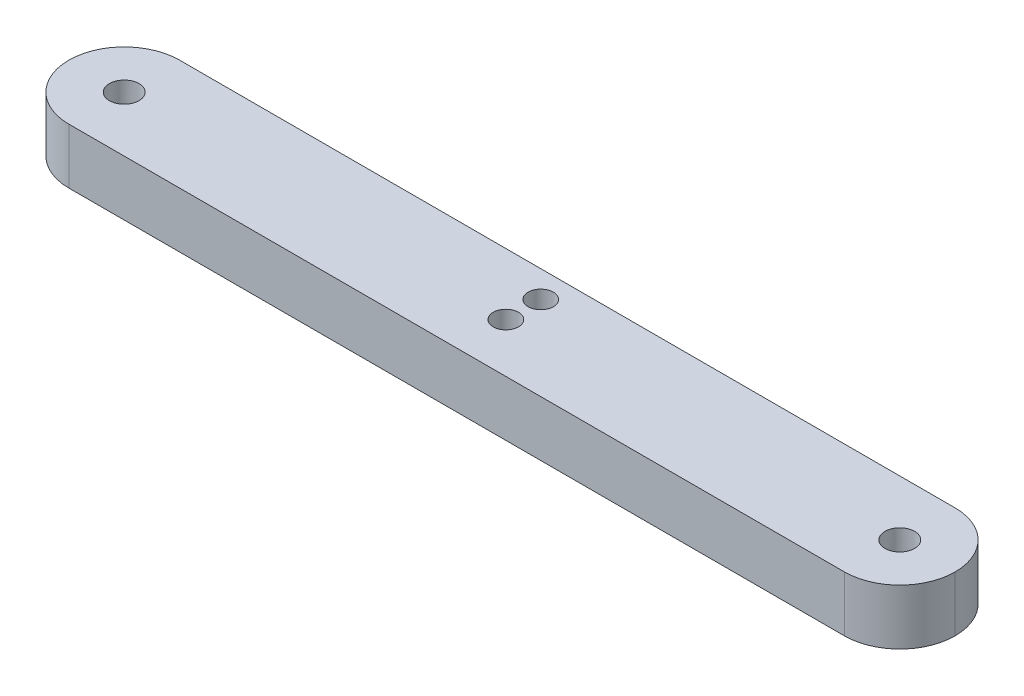
ISO-10303-21;
HEADER;
FILE_DESCRIPTION(('STEP AP214'),'2;1');
FILE_NAME('part.step','',(''),(''),'','','');
FILE_SCHEMA(('AUTOMOTIVE_DESIGN { 1 0 10303 214 1 1 1 1 }'));
ENDSEC;
DATA;
#1=APPLICATION_CONTEXT('core data for automotive mechanical design processes');
#2=APPLICATION_PROTOCOL_DEFINITION('international standard','automotive_design',2000,#1);
#3=PRODUCT_CONTEXT('',#1,'mechanical');
#4=PRODUCT('Part','Part','',(#3));
#5=PRODUCT_RELATED_PRODUCT_CATEGORY('part','',(#4));
#6=PRODUCT_DEFINITION_FORMATION('','',#4);
#7=PRODUCT_DEFINITION_CONTEXT('part definition',#1,'design');
#8=PRODUCT_DEFINITION('design','',#6,#7);
#9=PRODUCT_DEFINITION_SHAPE('','',#8);
#10=(LENGTH_UNIT() NAMED_UNIT(*) SI_UNIT(.MILLI.,.METRE.));
#11=(NAMED_UNIT(*) PLANE_ANGLE_UNIT() SI_UNIT($,.RADIAN.));
#12=(NAMED_UNIT(*) SI_UNIT($,.STERADIAN.) SOLID_ANGLE_UNIT());
#13=UNCERTAINTY_MEASURE_WITH_UNIT(LENGTH_MEASURE(1.E-05),#10,'distance_accuracy_value','');
#14=(GEOMETRIC_REPRESENTATION_CONTEXT(3) GLOBAL_UNCERTAINTY_ASSIGNED_CONTEXT((#13)) GLOBAL_UNIT_ASSIGNED_CONTEXT((#10,
#11,#12)) REPRESENTATION_CONTEXT('',''));
#15=CARTESIAN_POINT('',(0.,0.,0.));
#16=DIRECTION('',(0.,0.,1.));
#17=DIRECTION('',(1.,0.,0.));
#18=AXIS2_PLACEMENT_3D('',#15,#16,#17);
#19=CARTESIAN_POINT('',(0.,6.35,6.35000000000002));
#20=DIRECTION('',(0.,0.,-1.));
#21=DIRECTION('',(-1.,0.,0.));
#22=AXIS2_PLACEMENT_3D('',#19,#20,#21);
#23=PLANE('',#22);
#24=DIRECTION('',(1.,0.,0.));
#25=VECTOR('',#24,1.);
#26=CARTESIAN_POINT('',(0.,6.35,6.35000000000002));
#27=LINE('',#26,#25);
#28=CARTESIAN_POINT('',(-44.45,6.35,6.35000000000001));
#29=VERTEX_POINT('',#28);
#30=CARTESIAN_POINT('',(44.45,6.35,6.35000000000003));
#31=VERTEX_POINT('',#30);
#32=EDGE_CURVE('E121',#29,#31,#27,.T.);
#33=ORIENTED_EDGE('',*,*,#32,.F.);
#34=DIRECTION('',(0.,-1.,0.));
#35=VECTOR('',#34,1.);
#36=CARTESIAN_POINT('',(-44.45,0.,6.35000000000001));
#37=LINE('',#36,#35);
#38=CARTESIAN_POINT('',(-44.45,0.,6.35000000000001));
#39=VERTEX_POINT('',#38);
#40=EDGE_CURVE('E105',#29,#39,#37,.T.);
#41=ORIENTED_EDGE('',*,*,#40,.T.);
#42=DIRECTION('',(1.,0.,0.));
#43=VECTOR('',#42,1.);
#44=CARTESIAN_POINT('',(0.,0.,6.35000000000002));
#45=LINE('',#44,#43);
#46=CARTESIAN_POINT('',(44.45,0.,6.35000000000003));
#47=VERTEX_POINT('',#46);
#48=EDGE_CURVE('E118',#39,#47,#45,.T.);
#49=ORIENTED_EDGE('',*,*,#48,.T.);
#50=DIRECTION('',(0.,-1.,0.));
#51=VECTOR('',#50,1.);
#52=CARTESIAN_POINT('',(44.45,6.35,6.35000000000003));
#53=LINE('',#52,#51);
#54=EDGE_CURVE('E123',#47,#31,#53,.F.);
#55=ORIENTED_EDGE('',*,*,#54,.T.);
#56=EDGE_LOOP('',(#33,#41,#49,#55));
#57=FACE_BOUND('',#56,.T.);
#58=ADVANCED_FACE('F46',(#57),#23,.F.);
#59=CARTESIAN_POINT('',(0.,6.35,-6.34999999999999));
#60=DIRECTION('',(0.,0.,-1.));
#61=DIRECTION('',(-1.,0.,0.));
#62=AXIS2_PLACEMENT_3D('',#59,#60,#61);
#63=PLANE('',#62);
#64=DIRECTION('',(1.,0.,0.));
#65=VECTOR('',#64,1.);
#66=CARTESIAN_POINT('',(0.,6.35,-6.34999999999999));
#67=LINE('',#66,#65);
#68=CARTESIAN_POINT('',(-44.45,6.35,-6.34999999999999));
#69=VERTEX_POINT('',#68);
#70=CARTESIAN_POINT('',(44.45,6.35,-6.35));
#71=VERTEX_POINT('',#70);
#72=EDGE_CURVE('E171',#69,#71,#67,.T.);
#73=ORIENTED_EDGE('',*,*,#72,.T.);
#74=DIRECTION('',(0.,-1.,0.));
#75=VECTOR('',#74,1.);
#76=CARTESIAN_POINT('',(44.45,0.,-6.35));
#77=LINE('',#76,#75);
#78=CARTESIAN_POINT('',(44.45,0.,-6.35));
#79=VERTEX_POINT('',#78);
#80=EDGE_CURVE('E11',#71,#79,#77,.T.);
#81=ORIENTED_EDGE('',*,*,#80,.T.);
#82=DIRECTION('',(1.,0.,0.));
#83=VECTOR('',#82,1.);
#84=CARTESIAN_POINT('',(0.,0.,-6.34999999999999));
#85=LINE('',#84,#83);
#86=CARTESIAN_POINT('',(-44.45,0.,-6.34999999999999));
#87=VERTEX_POINT('',#86);
#88=EDGE_CURVE('E130',#87,#79,#85,.T.);
#89=ORIENTED_EDGE('',*,*,#88,.F.);
#90=DIRECTION('',(0.,-1.,0.));
#91=VECTOR('',#90,1.);
#92=CARTESIAN_POINT('',(-44.45,6.35,-6.34999999999999));
#93=LINE('',#92,#91);
#94=EDGE_CURVE('E56',#87,#69,#93,.F.);
#95=ORIENTED_EDGE('',*,*,#94,.T.);
#96=EDGE_LOOP('',(#73,#81,#89,#95));
#97=FACE_BOUND('',#96,.T.);
#98=ADVANCED_FACE('F170',(#97),#63,.T.);
#99=CARTESIAN_POINT('',(-44.45,6.35,0.));
#100=DIRECTION('',(0.,-1.,0.));
#101=DIRECTION('',(0.,0.,-1.));
#102=AXIS2_PLACEMENT_3D('',#99,#100,#101);
#103=CYLINDRICAL_SURFACE('',#102,1.7);
#104=CARTESIAN_POINT('',(-44.45,6.35,0.));
#105=DIRECTION('',(0.,1.,0.));
#106=DIRECTION('',(0.,0.,1.));
#107=AXIS2_PLACEMENT_3D('',#104,#105,#106);
#108=CIRCLE('',#107,1.7);
#109=CARTESIAN_POINT('',(-44.45,6.35,1.7));
#110=VERTEX_POINT('',#109);
#111=EDGE_CURVE('E177',#110,#110,#108,.T.);
#112=ORIENTED_EDGE('',*,*,#111,.T.);
#113=EDGE_LOOP('',(#112));
#114=FACE_BOUND('',#113,.T.);
#115=CARTESIAN_POINT('',(-44.45,0.,0.));
#116=DIRECTION('',(0.,1.,0.));
#117=DIRECTION('',(0.,0.,1.));
#118=AXIS2_PLACEMENT_3D('',#115,#116,#117);
#119=CIRCLE('',#118,1.7);
#120=CARTESIAN_POINT('',(-44.45,0.,1.7));
#121=VERTEX_POINT('',#120);
#122=EDGE_CURVE('E135',#121,#121,#119,.T.);
#123=ORIENTED_EDGE('',*,*,#122,.F.);
#124=EDGE_LOOP('',(#123));
#125=FACE_BOUND('',#124,.T.);
#126=ADVANCED_FACE('F197',(#114,#125),#103,.F.);
#127=CARTESIAN_POINT('',(44.45,6.35,0.));
#128=DIRECTION('',(0.,-1.,0.));
#129=DIRECTION('',(0.,0.,-1.));
#130=AXIS2_PLACEMENT_3D('',#127,#128,#129);
#131=CYLINDRICAL_SURFACE('',#130,1.7);
#132=CARTESIAN_POINT('',(44.45,6.35,0.));
#133=DIRECTION('',(0.,1.,0.));
#134=DIRECTION('',(0.,0.,1.));
#135=AXIS2_PLACEMENT_3D('',#132,#133,#134);
#136=CIRCLE('',#135,1.7);
#137=CARTESIAN_POINT('',(44.45,6.35,1.69999999999999));
#138=VERTEX_POINT('',#137);
#139=EDGE_CURVE('E138',#138,#138,#136,.F.);
#140=ORIENTED_EDGE('',*,*,#139,.F.);
#141=EDGE_LOOP('',(#140));
#142=FACE_BOUND('',#141,.T.);
#143=CARTESIAN_POINT('',(44.45,0.,0.));
#144=DIRECTION('',(0.,1.,0.));
#145=DIRECTION('',(0.,0.,1.));
#146=AXIS2_PLACEMENT_3D('',#143,#144,#145);
#147=CIRCLE('',#146,1.7);
#148=CARTESIAN_POINT('',(44.45,0.,1.69999999999999));
#149=VERTEX_POINT('',#148);
#150=EDGE_CURVE('E144',#149,#149,#147,.F.);
#151=ORIENTED_EDGE('',*,*,#150,.T.);
#152=EDGE_LOOP('',(#151));
#153=FACE_BOUND('',#152,.T.);
#154=ADVANCED_FACE('F194',(#142,#153),#131,.F.);
#155=CARTESIAN_POINT('',(0.,6.35,0.));
#156=DIRECTION('',(0.,1.,0.));
#157=DIRECTION('',(0.,0.,1.));
#158=AXIS2_PLACEMENT_3D('',#155,#156,#157);
#159=PLANE('',#158);
#160=CARTESIAN_POINT('',(0.,6.35,0.704506674075834));
#161=DIRECTION('',(0.,1.,0.));
#162=DIRECTION('',(0.,0.,1.));
#163=AXIS2_PLACEMENT_3D('',#160,#161,#162);
#164=CIRCLE('',#163,1.45);
#165=CARTESIAN_POINT('',(0.,6.35,2.15450667407583));
#166=VERTEX_POINT('',#165);
#167=EDGE_CURVE('E183',#166,#166,#164,.T.);
#168=ORIENTED_EDGE('',*,*,#167,.F.);
#169=EDGE_LOOP('',(#168));
#170=FACE_BOUND('',#169,.T.);
#171=CARTESIAN_POINT('',(0.,6.35,-3.29549332592417));
#172=DIRECTION('',(0.,1.,0.));
#173=DIRECTION('',(0.,0.,1.));
#174=AXIS2_PLACEMENT_3D('',#171,#172,#173);
#175=CIRCLE('',#174,1.45);
#176=CARTESIAN_POINT('',(0.,6.35,-1.84549332592417));
#177=VERTEX_POINT('',#176);
#178=EDGE_CURVE('E240',#177,#177,#175,.T.);
#179=ORIENTED_EDGE('',*,*,#178,.F.);
#180=EDGE_LOOP('',(#179));
#181=FACE_BOUND('',#180,.T.);
#182=ORIENTED_EDGE('',*,*,#32,.T.);
#183=CARTESIAN_POINT('',(44.45,6.35,0.));
#184=DIRECTION('',(0.,1.,0.));
#185=DIRECTION('',(0.,0.,1.));
#186=AXIS2_PLACEMENT_3D('',#183,#184,#185);
#187=CIRCLE('',#186,6.35);
#188=CARTESIAN_POINT('',(50.8,6.35,0.));
#189=VERTEX_POINT('',#188);
#190=EDGE_CURVE('E163',#31,#189,#187,.T.);
#191=ORIENTED_EDGE('',*,*,#190,.T.);
#192=CARTESIAN_POINT('',(44.45,6.35,0.));
#193=DIRECTION('',(0.,1.,0.));
#194=DIRECTION('',(0.,0.,1.));
#195=AXIS2_PLACEMENT_3D('',#192,#193,#194);
#196=CIRCLE('',#195,6.35);
#197=EDGE_CURVE('E70',#189,#71,#196,.T.);
#198=ORIENTED_EDGE('',*,*,#197,.T.);
#199=ORIENTED_EDGE('',*,*,#72,.F.);
#200=CARTESIAN_POINT('',(-44.45,6.35,0.));
#201=DIRECTION('',(0.,1.,0.));
#202=DIRECTION('',(0.,0.,1.));
#203=AXIS2_PLACEMENT_3D('',#200,#201,#202);
#204=CIRCLE('',#203,6.35);
#205=CARTESIAN_POINT('',(-50.8,6.35,0.));
#206=VERTEX_POINT('',#205);
#207=EDGE_CURVE('E64',#69,#206,#204,.T.);
#208=ORIENTED_EDGE('',*,*,#207,.T.);
#209=CARTESIAN_POINT('',(-44.45,6.35,0.));
#210=DIRECTION('',(0.,1.,0.));
#211=DIRECTION('',(0.,0.,1.));
#212=AXIS2_PLACEMENT_3D('',#209,#210,#211);
#213=CIRCLE('',#212,6.35);
#214=EDGE_CURVE('E158',#206,#29,#213,.T.);
#215=ORIENTED_EDGE('',*,*,#214,.T.);
#216=EDGE_LOOP('',(#182,#191,#198,#199,#208,#215));
#217=FACE_BOUND('',#216,.T.);
#218=ORIENTED_EDGE('',*,*,#111,.F.);
#219=EDGE_LOOP('',(#218));
#220=FACE_BOUND('',#219,.T.);
#221=ORIENTED_EDGE('',*,*,#139,.T.);
#222=EDGE_LOOP('',(#221));
#223=FACE_BOUND('',#222,.T.);
#224=ADVANCED_FACE('F174',(#170,#181,#217,#220,#223),#159,.T.);
#225=CARTESIAN_POINT('',(0.,0.,0.));
#226=DIRECTION('',(0.,1.,0.));
#227=DIRECTION('',(0.,0.,1.));
#228=AXIS2_PLACEMENT_3D('',#225,#226,#227);
#229=PLANE('',#228);
#230=CARTESIAN_POINT('',(0.,0.,0.704506674075834));
#231=DIRECTION('',(0.,1.,0.));
#232=DIRECTION('',(0.,0.,1.));
#233=AXIS2_PLACEMENT_3D('',#230,#231,#232);
#234=CIRCLE('',#233,1.45);
#235=CARTESIAN_POINT('',(0.,0.,2.15450667407583));
#236=VERTEX_POINT('',#235);
#237=EDGE_CURVE('E245',#236,#236,#234,.T.);
#238=ORIENTED_EDGE('',*,*,#237,.T.);
#239=EDGE_LOOP('',(#238));
#240=FACE_BOUND('',#239,.T.);
#241=CARTESIAN_POINT('',(0.,0.,-3.29549332592417));
#242=DIRECTION('',(0.,1.,0.));
#243=DIRECTION('',(0.,0.,1.));
#244=AXIS2_PLACEMENT_3D('',#241,#242,#243);
#245=CIRCLE('',#244,1.45);
#246=CARTESIAN_POINT('',(0.,0.,-1.84549332592417));
#247=VERTEX_POINT('',#246);
#248=EDGE_CURVE('E248',#247,#247,#245,.T.);
#249=ORIENTED_EDGE('',*,*,#248,.T.);
#250=EDGE_LOOP('',(#249));
#251=FACE_BOUND('',#250,.T.);
#252=CARTESIAN_POINT('',(44.45,0.,0.));
#253=DIRECTION('',(0.,1.,0.));
#254=DIRECTION('',(0.,0.,1.));
#255=AXIS2_PLACEMENT_3D('',#252,#253,#254);
#256=CIRCLE('',#255,6.35);
#257=CARTESIAN_POINT('',(50.8,0.,0.));
#258=VERTEX_POINT('',#257);
#259=EDGE_CURVE('E111',#79,#258,#256,.F.);
#260=ORIENTED_EDGE('',*,*,#259,.T.);
#261=CARTESIAN_POINT('',(44.45,0.,0.));
#262=DIRECTION('',(0.,1.,0.));
#263=DIRECTION('',(0.,0.,1.));
#264=AXIS2_PLACEMENT_3D('',#261,#262,#263);
#265=CIRCLE('',#264,6.35);
#266=EDGE_CURVE('E128',#258,#47,#265,.F.);
#267=ORIENTED_EDGE('',*,*,#266,.T.);
#268=ORIENTED_EDGE('',*,*,#48,.F.);
#269=CARTESIAN_POINT('',(-44.45,0.,0.));
#270=DIRECTION('',(0.,1.,0.));
#271=DIRECTION('',(0.,0.,1.));
#272=AXIS2_PLACEMENT_3D('',#269,#270,#271);
#273=CIRCLE('',#272,6.35);
#274=CARTESIAN_POINT('',(-50.8,0.,0.));
#275=VERTEX_POINT('',#274);
#276=EDGE_CURVE('E101',#39,#275,#273,.F.);
#277=ORIENTED_EDGE('',*,*,#276,.T.);
#278=CARTESIAN_POINT('',(-44.45,0.,0.));
#279=DIRECTION('',(0.,1.,0.));
#280=DIRECTION('',(0.,0.,1.));
#281=AXIS2_PLACEMENT_3D('',#278,#279,#280);
#282=CIRCLE('',#281,6.35);
#283=EDGE_CURVE('E112',#275,#87,#282,.F.);
#284=ORIENTED_EDGE('',*,*,#283,.T.);
#285=ORIENTED_EDGE('',*,*,#88,.T.);
#286=EDGE_LOOP('',(#260,#267,#268,#277,#284,#285));
#287=FACE_BOUND('',#286,.T.);
#288=ORIENTED_EDGE('',*,*,#122,.T.);
#289=EDGE_LOOP('',(#288));
#290=FACE_BOUND('',#289,.T.);
#291=ORIENTED_EDGE('',*,*,#150,.F.);
#292=EDGE_LOOP('',(#291));
#293=FACE_BOUND('',#292,.T.);
#294=ADVANCED_FACE('F125',(#240,#251,#287,#290,#293),#229,.F.);
#295=CARTESIAN_POINT('',(-44.45,6.35,0.));
#296=DIRECTION('',(0.,-1.,0.));
#297=DIRECTION('',(0.,0.,-1.));
#298=AXIS2_PLACEMENT_3D('',#295,#296,#297);
#299=CYLINDRICAL_SURFACE('',#298,6.35);
#300=DIRECTION('',(0.,-1.,0.));
#301=VECTOR('',#300,1.);
#302=CARTESIAN_POINT('',(-50.8,6.35,0.));
#303=LINE('',#302,#301);
#304=EDGE_CURVE('E106',#206,#275,#303,.T.);
#305=ORIENTED_EDGE('',*,*,#304,.F.);
#306=ORIENTED_EDGE('',*,*,#207,.F.);
#307=ORIENTED_EDGE('',*,*,#94,.F.);
#308=ORIENTED_EDGE('',*,*,#283,.F.);
#309=EDGE_LOOP('',(#305,#306,#307,#308));
#310=FACE_BOUND('',#309,.T.);
#311=ADVANCED_FACE('F179',(#310),#299,.T.);
#312=CARTESIAN_POINT('',(-44.45,6.35,0.));
#313=DIRECTION('',(0.,1.,0.));
#314=DIRECTION('',(0.,0.,1.));
#315=AXIS2_PLACEMENT_3D('',#312,#313,#314);
#316=CYLINDRICAL_SURFACE('',#315,6.35);
#317=ORIENTED_EDGE('',*,*,#214,.F.);
#318=ORIENTED_EDGE('',*,*,#304,.T.);
#319=ORIENTED_EDGE('',*,*,#276,.F.);
#320=ORIENTED_EDGE('',*,*,#40,.F.);
#321=EDGE_LOOP('',(#317,#318,#319,#320));
#322=FACE_BOUND('',#321,.T.);
#323=ADVANCED_FACE('F104',(#322),#316,.T.);
#324=CARTESIAN_POINT('',(44.45,6.35,0.));
#325=DIRECTION('',(0.,1.,0.));
#326=DIRECTION('',(0.,0.,1.));
#327=AXIS2_PLACEMENT_3D('',#324,#325,#326);
#328=CYLINDRICAL_SURFACE('',#327,6.35);
#329=ORIENTED_EDGE('',*,*,#80,.F.);
#330=ORIENTED_EDGE('',*,*,#197,.F.);
#331=DIRECTION('',(0.,-1.,0.));
#332=VECTOR('',#331,1.);
#333=CARTESIAN_POINT('',(50.8,6.35,0.));
#334=LINE('',#333,#332);
#335=EDGE_CURVE('E50',#258,#189,#334,.F.);
#336=ORIENTED_EDGE('',*,*,#335,.F.);
#337=ORIENTED_EDGE('',*,*,#259,.F.);
#338=EDGE_LOOP('',(#329,#330,#336,#337));
#339=FACE_BOUND('',#338,.T.);
#340=ADVANCED_FACE('F48',(#339),#328,.T.);
#341=CARTESIAN_POINT('',(44.45,6.35,0.));
#342=DIRECTION('',(0.,-1.,0.));
#343=DIRECTION('',(0.,0.,-1.));
#344=AXIS2_PLACEMENT_3D('',#341,#342,#343);
#345=CYLINDRICAL_SURFACE('',#344,6.35);
#346=ORIENTED_EDGE('',*,*,#190,.F.);
#347=ORIENTED_EDGE('',*,*,#54,.F.);
#348=ORIENTED_EDGE('',*,*,#266,.F.);
#349=ORIENTED_EDGE('',*,*,#335,.T.);
#350=EDGE_LOOP('',(#346,#347,#348,#349));
#351=FACE_BOUND('',#350,.T.);
#352=ADVANCED_FACE('F223',(#351),#345,.T.);
#353=CARTESIAN_POINT('',(0.,0.,-3.29549332592417));
#354=DIRECTION('',(0.,1.,0.));
#355=DIRECTION('',(0.,0.,1.));
#356=AXIS2_PLACEMENT_3D('',#353,#354,#355);
#357=CYLINDRICAL_SURFACE('',#356,1.45);
#358=ORIENTED_EDGE('',*,*,#178,.T.);
#359=EDGE_LOOP('',(#358));
#360=FACE_BOUND('',#359,.T.);
#361=ORIENTED_EDGE('',*,*,#248,.F.);
#362=EDGE_LOOP('',(#361));
#363=FACE_BOUND('',#362,.T.);
#364=ADVANCED_FACE('F225',(#360,#363),#357,.F.);
#365=CARTESIAN_POINT('',(0.,0.,0.704506674075834));
#366=DIRECTION('',(0.,1.,0.));
#367=DIRECTION('',(0.,0.,1.));
#368=AXIS2_PLACEMENT_3D('',#365,#366,#367);
#369=CYLINDRICAL_SURFACE('',#368,1.45);
#370=ORIENTED_EDGE('',*,*,#167,.T.);
#371=EDGE_LOOP('',(#370));
#372=FACE_BOUND('',#371,.T.);
#373=ORIENTED_EDGE('',*,*,#237,.F.);
#374=EDGE_LOOP('',(#373));
#375=FACE_BOUND('',#374,.T.);
#376=ADVANCED_FACE('F230',(#372,#375),#369,.F.);
#377=CLOSED_SHELL('',(#58,#98,#126,#154,#224,#294,#311,#323,#340,#352,#364,#376));
#378=MANIFOLD_SOLID_BREP('B2',#377);
#379=ADVANCED_BREP_SHAPE_REPRESENTATION('',(#18,#378),#14);
#380=SHAPE_DEFINITION_REPRESENTATION(#9,#379);
ENDSEC;
END-ISO-10303-21;
